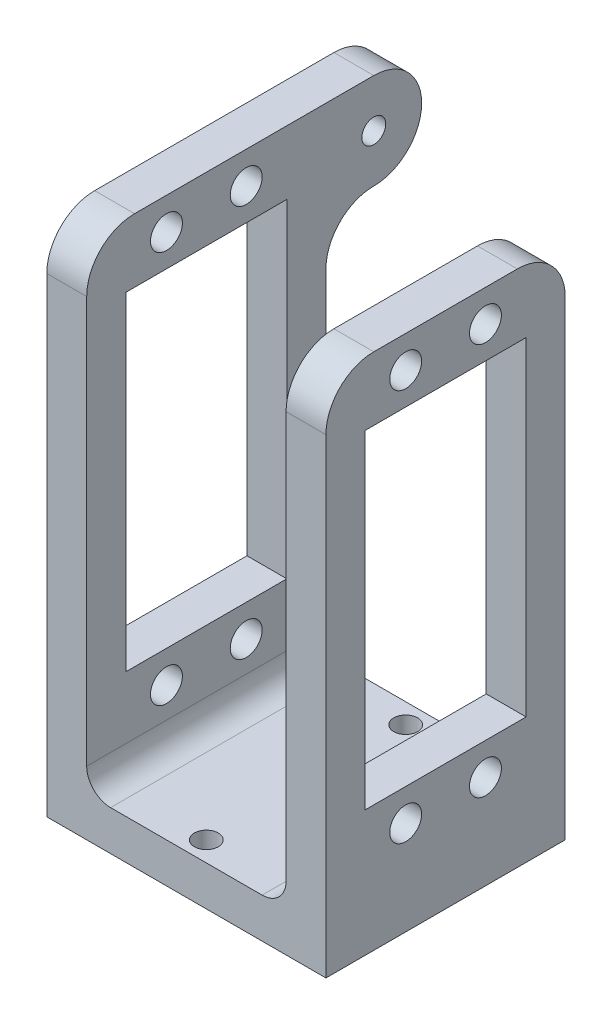
ISO-10303-21;
HEADER;
FILE_DESCRIPTION(('STEP AP214'),'2;1');
FILE_NAME('part.step','',(''),(''),'','','');
FILE_SCHEMA(('AUTOMOTIVE_DESIGN { 1 0 10303 214 1 1 1 1 }'));
ENDSEC;
DATA;
#1=APPLICATION_CONTEXT('core data for automotive mechanical design processes');
#2=APPLICATION_PROTOCOL_DEFINITION('international standard','automotive_design',2000,#1);
#3=PRODUCT_CONTEXT('',#1,'mechanical');
#4=PRODUCT('Part','Part','',(#3));
#5=PRODUCT_RELATED_PRODUCT_CATEGORY('part','',(#4));
#6=PRODUCT_DEFINITION_FORMATION('','',#4);
#7=PRODUCT_DEFINITION_CONTEXT('part definition',#1,'design');
#8=PRODUCT_DEFINITION('design','',#6,#7);
#9=PRODUCT_DEFINITION_SHAPE('','',#8);
#10=(LENGTH_UNIT() NAMED_UNIT(*) SI_UNIT(.MILLI.,.METRE.));
#11=(NAMED_UNIT(*) PLANE_ANGLE_UNIT() SI_UNIT($,.RADIAN.));
#12=(NAMED_UNIT(*) SI_UNIT($,.STERADIAN.) SOLID_ANGLE_UNIT());
#13=UNCERTAINTY_MEASURE_WITH_UNIT(LENGTH_MEASURE(1.E-05),#10,'distance_accuracy_value','');
#14=(GEOMETRIC_REPRESENTATION_CONTEXT(3) GLOBAL_UNCERTAINTY_ASSIGNED_CONTEXT((#13)) GLOBAL_UNIT_ASSIGNED_CONTEXT((#10,
#11,#12)) REPRESENTATION_CONTEXT('',''));
#15=CARTESIAN_POINT('',(0.,0.,0.));
#16=DIRECTION('',(0.,0.,1.));
#17=DIRECTION('',(1.,0.,0.));
#18=AXIS2_PLACEMENT_3D('',#15,#16,#17);
#19=CARTESIAN_POINT('',(0.,5.,-30.));
#20=DIRECTION('',(0.,0.,1.));
#21=DIRECTION('',(1.,0.,0.));
#22=AXIS2_PLACEMENT_3D('',#19,#20,#21);
#23=PLANE('',#22);
#24=DIRECTION('',(0.,-1.,0.));
#25=VECTOR('',#24,1.);
#26=CARTESIAN_POINT('',(30.,65.,-30.));
#27=LINE('',#26,#25);
#28=CARTESIAN_POINT('',(30.,59.,-30.));
#29=VERTEX_POINT('',#28);
#30=CARTESIAN_POINT('',(30.,8.,-30.));
#31=VERTEX_POINT('',#30);
#32=EDGE_CURVE('E315',#29,#31,#27,.T.);
#33=ORIENTED_EDGE('',*,*,#32,.F.);
#34=DIRECTION('',(-1.,0.,0.));
#35=VECTOR('',#34,1.);
#36=CARTESIAN_POINT('',(0.,59.,-30.));
#37=LINE('',#36,#35);
#38=CARTESIAN_POINT('',(35.,59.,-30.));
#39=VERTEX_POINT('',#38);
#40=EDGE_CURVE('E401',#29,#39,#37,.F.);
#41=ORIENTED_EDGE('',*,*,#40,.T.);
#42=DIRECTION('',(0.,-1.,0.));
#43=VECTOR('',#42,1.);
#44=CARTESIAN_POINT('',(35.,5.,-30.));
#45=LINE('',#44,#43);
#46=CARTESIAN_POINT('',(35.,0.,-30.));
#47=VERTEX_POINT('',#46);
#48=EDGE_CURVE('E344',#39,#47,#45,.T.);
#49=ORIENTED_EDGE('',*,*,#48,.T.);
#50=DIRECTION('',(-1.,0.,0.));
#51=VECTOR('',#50,1.);
#52=CARTESIAN_POINT('',(0.,0.,-30.));
#53=LINE('',#52,#51);
#54=CARTESIAN_POINT('',(0.,0.,-30.));
#55=VERTEX_POINT('',#54);
#56=EDGE_CURVE('E329',#47,#55,#53,.T.);
#57=ORIENTED_EDGE('',*,*,#56,.T.);
#58=DIRECTION('',(0.,-1.,0.));
#59=VECTOR('',#58,1.);
#60=CARTESIAN_POINT('',(0.,5.,-30.));
#61=LINE('',#60,#59);
#62=CARTESIAN_POINT('',(0.,47.,-30.));
#63=VERTEX_POINT('',#62);
#64=EDGE_CURVE('E332',#63,#55,#61,.T.);
#65=ORIENTED_EDGE('',*,*,#64,.F.);
#66=DIRECTION('',(-1.,0.,0.));
#67=VECTOR('',#66,1.);
#68=CARTESIAN_POINT('',(5.,47.,-30.));
#69=LINE('',#68,#67);
#70=CARTESIAN_POINT('',(5.,47.,-30.));
#71=VERTEX_POINT('',#70);
#72=EDGE_CURVE('E389',#63,#71,#69,.F.);
#73=ORIENTED_EDGE('',*,*,#72,.T.);
#74=DIRECTION('',(0.,-1.,0.));
#75=VECTOR('',#74,1.);
#76=CARTESIAN_POINT('',(5.,65.,-30.));
#77=LINE('',#76,#75);
#78=CARTESIAN_POINT('',(5.,8.,-30.));
#79=VERTEX_POINT('',#78);
#80=EDGE_CURVE('E196',#71,#79,#77,.T.);
#81=ORIENTED_EDGE('',*,*,#80,.T.);
#82=CARTESIAN_POINT('',(8.,8.,-30.));
#83=DIRECTION('',(0.,0.,1.));
#84=DIRECTION('',(1.,0.,0.));
#85=AXIS2_PLACEMENT_3D('',#82,#83,#84);
#86=CIRCLE('',#85,3.);
#87=CARTESIAN_POINT('',(8.,5.,-30.));
#88=VERTEX_POINT('',#87);
#89=EDGE_CURVE('E384',#79,#88,#86,.T.);
#90=ORIENTED_EDGE('',*,*,#89,.T.);
#91=DIRECTION('',(-1.,0.,0.));
#92=VECTOR('',#91,1.);
#93=CARTESIAN_POINT('',(0.,5.,-30.));
#94=LINE('',#93,#92);
#95=CARTESIAN_POINT('',(27.,5.,-30.));
#96=VERTEX_POINT('',#95);
#97=EDGE_CURVE('E328',#96,#88,#94,.T.);
#98=ORIENTED_EDGE('',*,*,#97,.F.);
#99=CARTESIAN_POINT('',(27.,8.,-30.));
#100=DIRECTION('',(0.,0.,1.));
#101=DIRECTION('',(1.,0.,0.));
#102=AXIS2_PLACEMENT_3D('',#99,#100,#101);
#103=CIRCLE('',#102,3.);
#104=EDGE_CURVE('E381',#96,#31,#103,.T.);
#105=ORIENTED_EDGE('',*,*,#104,.T.);
#106=EDGE_LOOP('',(#33,#41,#49,#57,#65,#73,#81,#90,#98,#105));
#107=FACE_BOUND('',#106,.T.);
#108=ADVANCED_FACE('F34',(#107),#23,.F.);
#109=CARTESIAN_POINT('',(0.,5.,0.));
#110=DIRECTION('',(0.,-1.,0.));
#111=DIRECTION('',(0.,0.,-1.));
#112=AXIS2_PLACEMENT_3D('',#109,#110,#111);
#113=PLANE('',#112);
#114=CARTESIAN_POINT('',(17.5,5.,-27.5));
#115=DIRECTION('',(0.,1.,0.));
#116=DIRECTION('',(0.,0.,1.));
#117=AXIS2_PLACEMENT_3D('',#114,#115,#116);
#118=CIRCLE('',#117,1.5);
#119=CARTESIAN_POINT('',(17.5,5.,-26.));
#120=VERTEX_POINT('',#119);
#121=EDGE_CURVE('E438',#120,#120,#118,.T.);
#122=ORIENTED_EDGE('',*,*,#121,.F.);
#123=EDGE_LOOP('',(#122));
#124=FACE_BOUND('',#123,.T.);
#125=CARTESIAN_POINT('',(17.5,5.,-2.5));
#126=DIRECTION('',(0.,1.,0.));
#127=DIRECTION('',(0.,0.,1.));
#128=AXIS2_PLACEMENT_3D('',#125,#126,#127);
#129=CIRCLE('',#128,1.5);
#130=CARTESIAN_POINT('',(17.5,5.,-0.999999999999999));
#131=VERTEX_POINT('',#130);
#132=EDGE_CURVE('E432',#131,#131,#129,.T.);
#133=ORIENTED_EDGE('',*,*,#132,.F.);
#134=EDGE_LOOP('',(#133));
#135=FACE_BOUND('',#134,.T.);
#136=DIRECTION('',(1.,0.,0.));
#137=VECTOR('',#136,1.);
#138=CARTESIAN_POINT('',(0.,5.,0.));
#139=LINE('',#138,#137);
#140=CARTESIAN_POINT('',(8.,5.,0.));
#141=VERTEX_POINT('',#140);
#142=CARTESIAN_POINT('',(27.,5.,0.));
#143=VERTEX_POINT('',#142);
#144=EDGE_CURVE('E325',#141,#143,#139,.T.);
#145=ORIENTED_EDGE('',*,*,#144,.T.);
#146=DIRECTION('',(0.,0.,1.));
#147=VECTOR('',#146,1.);
#148=CARTESIAN_POINT('',(27.,5.,-30.));
#149=LINE('',#148,#147);
#150=EDGE_CURVE('E375',#143,#96,#149,.F.);
#151=ORIENTED_EDGE('',*,*,#150,.T.);
#152=ORIENTED_EDGE('',*,*,#97,.T.);
#153=DIRECTION('',(0.,0.,-1.));
#154=VECTOR('',#153,1.);
#155=CARTESIAN_POINT('',(8.,5.,0.));
#156=LINE('',#155,#154);
#157=EDGE_CURVE('E373',#88,#141,#156,.F.);
#158=ORIENTED_EDGE('',*,*,#157,.T.);
#159=EDGE_LOOP('',(#145,#151,#152,#158));
#160=FACE_BOUND('',#159,.T.);
#161=ADVANCED_FACE('F455',(#124,#135,#160),#113,.F.);
#162=CARTESIAN_POINT('',(0.,5.,0.));
#163=DIRECTION('',(1.,0.,0.));
#164=DIRECTION('',(0.,0.,-1.));
#165=AXIS2_PLACEMENT_3D('',#162,#163,#164);
#166=PLANE('',#165);
#167=CARTESIAN_POINT('',(0.,11.8,-20.));
#168=DIRECTION('',(1.,0.,0.));
#169=DIRECTION('',(0.,0.,-1.));
#170=AXIS2_PLACEMENT_3D('',#167,#168,#169);
#171=CIRCLE('',#170,2.);
#172=CARTESIAN_POINT('',(0.,11.8,-22.));
#173=VERTEX_POINT('',#172);
#174=EDGE_CURVE('E304',#173,#173,#171,.T.);
#175=ORIENTED_EDGE('',*,*,#174,.T.);
#176=EDGE_LOOP('',(#175));
#177=FACE_BOUND('',#176,.T.);
#178=CARTESIAN_POINT('',(0.,11.8,-10.));
#179=DIRECTION('',(1.,0.,0.));
#180=DIRECTION('',(0.,0.,-1.));
#181=AXIS2_PLACEMENT_3D('',#178,#179,#180);
#182=CIRCLE('',#181,2.);
#183=CARTESIAN_POINT('',(0.,11.8,-12.));
#184=VERTEX_POINT('',#183);
#185=EDGE_CURVE('E297',#184,#184,#182,.T.);
#186=ORIENTED_EDGE('',*,*,#185,.T.);
#187=EDGE_LOOP('',(#186));
#188=FACE_BOUND('',#187,.T.);
#189=CARTESIAN_POINT('',(0.,61.,-20.));
#190=DIRECTION('',(1.,0.,0.));
#191=DIRECTION('',(0.,0.,-1.));
#192=AXIS2_PLACEMENT_3D('',#189,#190,#191);
#193=CIRCLE('',#192,2.);
#194=CARTESIAN_POINT('',(0.,61.,-22.));
#195=VERTEX_POINT('',#194);
#196=EDGE_CURVE('E290',#195,#195,#193,.T.);
#197=ORIENTED_EDGE('',*,*,#196,.T.);
#198=EDGE_LOOP('',(#197));
#199=FACE_BOUND('',#198,.T.);
#200=CARTESIAN_POINT('',(0.,61.,-10.));
#201=DIRECTION('',(1.,0.,0.));
#202=DIRECTION('',(0.,0.,-1.));
#203=AXIS2_PLACEMENT_3D('',#200,#201,#202);
#204=CIRCLE('',#203,2.);
#205=CARTESIAN_POINT('',(0.,61.,-12.));
#206=VERTEX_POINT('',#205);
#207=EDGE_CURVE('E283',#206,#206,#204,.T.);
#208=ORIENTED_EDGE('',*,*,#207,.T.);
#209=EDGE_LOOP('',(#208));
#210=FACE_BOUND('',#209,.T.);
#211=DIRECTION('',(0.,0.,1.));
#212=VECTOR('',#211,1.);
#213=CARTESIAN_POINT('',(0.,57.,0.));
#214=LINE('',#213,#212);
#215=CARTESIAN_POINT('',(0.,57.,-25.1));
#216=VERTEX_POINT('',#215);
#217=CARTESIAN_POINT('',(0.,57.,-4.9));
#218=VERTEX_POINT('',#217);
#219=EDGE_CURVE('E270',#216,#218,#214,.T.);
#220=ORIENTED_EDGE('',*,*,#219,.T.);
#221=DIRECTION('',(0.,-1.,0.));
#222=VECTOR('',#221,1.);
#223=CARTESIAN_POINT('',(0.,5.,-4.9));
#224=LINE('',#223,#222);
#225=CARTESIAN_POINT('',(0.,15.8,-4.9));
#226=VERTEX_POINT('',#225);
#227=EDGE_CURVE('E276',#218,#226,#224,.T.);
#228=ORIENTED_EDGE('',*,*,#227,.T.);
#229=DIRECTION('',(0.,0.,-1.));
#230=VECTOR('',#229,1.);
#231=CARTESIAN_POINT('',(0.,15.8,0.));
#232=LINE('',#231,#230);
#233=CARTESIAN_POINT('',(0.,15.8,-25.1));
#234=VERTEX_POINT('',#233);
#235=EDGE_CURVE('E258',#226,#234,#232,.T.);
#236=ORIENTED_EDGE('',*,*,#235,.T.);
#237=DIRECTION('',(0.,1.,0.));
#238=VECTOR('',#237,1.);
#239=CARTESIAN_POINT('',(0.,5.,-25.1));
#240=LINE('',#239,#238);
#241=EDGE_CURVE('E264',#234,#216,#240,.T.);
#242=ORIENTED_EDGE('',*,*,#241,.T.);
#243=EDGE_LOOP('',(#220,#228,#236,#242));
#244=FACE_BOUND('',#243,.T.);
#245=DIRECTION('',(0.,-1.,0.));
#246=VECTOR('',#245,1.);
#247=CARTESIAN_POINT('',(0.,5.,0.));
#248=LINE('',#247,#246);
#249=CARTESIAN_POINT('',(0.,59.,0.));
#250=VERTEX_POINT('',#249);
#251=CARTESIAN_POINT('',(0.,0.,0.));
#252=VERTEX_POINT('',#251);
#253=EDGE_CURVE('E348',#250,#252,#248,.T.);
#254=ORIENTED_EDGE('',*,*,#253,.F.);
#255=CARTESIAN_POINT('',(0.,59.,-6.));
#256=DIRECTION('',(1.,0.,0.));
#257=DIRECTION('',(0.,0.,-1.));
#258=AXIS2_PLACEMENT_3D('',#255,#256,#257);
#259=CIRCLE('',#258,6.);
#260=CARTESIAN_POINT('',(0.,65.,-6.));
#261=VERTEX_POINT('',#260);
#262=EDGE_CURVE('E11',#250,#261,#259,.F.);
#263=ORIENTED_EDGE('',*,*,#262,.T.);
#264=DIRECTION('',(0.,0.,1.));
#265=VECTOR('',#264,1.);
#266=CARTESIAN_POINT('',(0.,65.,-30.));
#267=LINE('',#266,#265);
#268=CARTESIAN_POINT('',(0.,65.,-36.));
#269=VERTEX_POINT('',#268);
#270=EDGE_CURVE('E317',#269,#261,#267,.T.);
#271=ORIENTED_EDGE('',*,*,#270,.F.);
#272=CARTESIAN_POINT('',(0.,59.,-36.));
#273=DIRECTION('',(-1.,0.,0.));
#274=DIRECTION('',(0.,0.,1.));
#275=AXIS2_PLACEMENT_3D('',#272,#273,#274);
#276=CIRCLE('',#275,6.00000000000001);
#277=CARTESIAN_POINT('',(0.,53.,-36.));
#278=VERTEX_POINT('',#277);
#279=EDGE_CURVE('E423',#269,#278,#276,.T.);
#280=ORIENTED_EDGE('',*,*,#279,.T.);
#281=CARTESIAN_POINT('',(0.,47.,-36.));
#282=DIRECTION('',(1.,0.,0.));
#283=DIRECTION('',(0.,0.,-1.));
#284=AXIS2_PLACEMENT_3D('',#281,#282,#283);
#285=CIRCLE('',#284,6.);
#286=EDGE_CURVE('E201',#278,#63,#285,.T.);
#287=ORIENTED_EDGE('',*,*,#286,.T.);
#288=ORIENTED_EDGE('',*,*,#64,.T.);
#289=DIRECTION('',(0.,0.,1.));
#290=VECTOR('',#289,1.);
#291=CARTESIAN_POINT('',(0.,0.,0.));
#292=LINE('',#291,#290);
#293=EDGE_CURVE('E324',#55,#252,#292,.T.);
#294=ORIENTED_EDGE('',*,*,#293,.T.);
#295=EDGE_LOOP('',(#254,#263,#271,#280,#287,#288,#294));
#296=FACE_BOUND('',#295,.T.);
#297=CARTESIAN_POINT('',(0.,59.,-36.));
#298=DIRECTION('',(-1.,0.,0.));
#299=DIRECTION('',(0.,0.,1.));
#300=AXIS2_PLACEMENT_3D('',#297,#298,#299);
#301=CIRCLE('',#300,1.5);
#302=CARTESIAN_POINT('',(0.,59.,-34.5));
#303=VERTEX_POINT('',#302);
#304=EDGE_CURVE('E425',#303,#303,#301,.T.);
#305=ORIENTED_EDGE('',*,*,#304,.F.);
#306=EDGE_LOOP('',(#305));
#307=FACE_BOUND('',#306,.T.);
#308=ADVANCED_FACE('F421',(#177,#188,#199,#210,#244,#296,#307),#166,.F.);
#309=CARTESIAN_POINT('',(0.,5.,0.));
#310=DIRECTION('',(0.,0.,-1.));
#311=DIRECTION('',(-1.,0.,0.));
#312=AXIS2_PLACEMENT_3D('',#309,#310,#311);
#313=PLANE('',#312);
#314=DIRECTION('',(0.,-1.,0.));
#315=VECTOR('',#314,1.);
#316=CARTESIAN_POINT('',(35.,5.,0.));
#317=LINE('',#316,#315);
#318=CARTESIAN_POINT('',(35.,59.,0.));
#319=VERTEX_POINT('',#318);
#320=CARTESIAN_POINT('',(35.,0.,0.));
#321=VERTEX_POINT('',#320);
#322=EDGE_CURVE('E346',#319,#321,#317,.T.);
#323=ORIENTED_EDGE('',*,*,#322,.F.);
#324=DIRECTION('',(1.,0.,0.));
#325=VECTOR('',#324,1.);
#326=CARTESIAN_POINT('',(0.,59.,0.));
#327=LINE('',#326,#325);
#328=CARTESIAN_POINT('',(30.,59.,0.));
#329=VERTEX_POINT('',#328);
#330=EDGE_CURVE('E409',#319,#329,#327,.F.);
#331=ORIENTED_EDGE('',*,*,#330,.T.);
#332=DIRECTION('',(0.,-1.,0.));
#333=VECTOR('',#332,1.);
#334=CARTESIAN_POINT('',(30.,65.,0.));
#335=LINE('',#334,#333);
#336=CARTESIAN_POINT('',(30.,8.,0.));
#337=VERTEX_POINT('',#336);
#338=EDGE_CURVE('E313',#329,#337,#335,.T.);
#339=ORIENTED_EDGE('',*,*,#338,.T.);
#340=CARTESIAN_POINT('',(27.,8.,0.));
#341=DIRECTION('',(0.,0.,-1.));
#342=DIRECTION('',(-1.,0.,0.));
#343=AXIS2_PLACEMENT_3D('',#340,#341,#342);
#344=CIRCLE('',#343,3.);
#345=EDGE_CURVE('E379',#337,#143,#344,.T.);
#346=ORIENTED_EDGE('',*,*,#345,.T.);
#347=ORIENTED_EDGE('',*,*,#144,.F.);
#348=CARTESIAN_POINT('',(8.,8.,0.));
#349=DIRECTION('',(0.,0.,-1.));
#350=DIRECTION('',(-1.,0.,0.));
#351=AXIS2_PLACEMENT_3D('',#348,#349,#350);
#352=CIRCLE('',#351,3.);
#353=CARTESIAN_POINT('',(5.,8.,0.));
#354=VERTEX_POINT('',#353);
#355=EDGE_CURVE('E386',#141,#354,#352,.T.);
#356=ORIENTED_EDGE('',*,*,#355,.T.);
#357=DIRECTION('',(0.,-1.,0.));
#358=VECTOR('',#357,1.);
#359=CARTESIAN_POINT('',(5.,65.,0.));
#360=LINE('',#359,#358);
#361=CARTESIAN_POINT('',(5.,59.,0.));
#362=VERTEX_POINT('',#361);
#363=EDGE_CURVE('E322',#362,#354,#360,.T.);
#364=ORIENTED_EDGE('',*,*,#363,.F.);
#365=DIRECTION('',(1.,0.,0.));
#366=VECTOR('',#365,1.);
#367=CARTESIAN_POINT('',(0.,59.,0.));
#368=LINE('',#367,#366);
#369=EDGE_CURVE('E407',#362,#250,#368,.F.);
#370=ORIENTED_EDGE('',*,*,#369,.T.);
#371=ORIENTED_EDGE('',*,*,#253,.T.);
#372=DIRECTION('',(1.,0.,0.));
#373=VECTOR('',#372,1.);
#374=CARTESIAN_POINT('',(0.,0.,0.));
#375=LINE('',#374,#373);
#376=EDGE_CURVE('E335',#252,#321,#375,.T.);
#377=ORIENTED_EDGE('',*,*,#376,.T.);
#378=EDGE_LOOP('',(#323,#331,#339,#346,#347,#356,#364,#370,#371,#377));
#379=FACE_BOUND('',#378,.T.);
#380=ADVANCED_FACE('F415',(#379),#313,.F.);
#381=CARTESIAN_POINT('',(35.,5.,0.));
#382=DIRECTION('',(-1.,0.,0.));
#383=DIRECTION('',(0.,0.,1.));
#384=AXIS2_PLACEMENT_3D('',#381,#382,#383);
#385=PLANE('',#384);
#386=CARTESIAN_POINT('',(35.,11.8,-20.));
#387=DIRECTION('',(1.,0.,0.));
#388=DIRECTION('',(0.,0.,-1.));
#389=AXIS2_PLACEMENT_3D('',#386,#387,#388);
#390=CIRCLE('',#389,2.);
#391=CARTESIAN_POINT('',(35.,11.8,-22.));
#392=VERTEX_POINT('',#391);
#393=EDGE_CURVE('E216',#392,#392,#390,.T.);
#394=ORIENTED_EDGE('',*,*,#393,.F.);
#395=EDGE_LOOP('',(#394));
#396=FACE_BOUND('',#395,.T.);
#397=CARTESIAN_POINT('',(35.,11.8,-10.));
#398=DIRECTION('',(1.,0.,0.));
#399=DIRECTION('',(0.,0.,-1.));
#400=AXIS2_PLACEMENT_3D('',#397,#398,#399);
#401=CIRCLE('',#400,2.);
#402=CARTESIAN_POINT('',(35.,11.8,-12.));
#403=VERTEX_POINT('',#402);
#404=EDGE_CURVE('E227',#403,#403,#401,.T.);
#405=ORIENTED_EDGE('',*,*,#404,.F.);
#406=EDGE_LOOP('',(#405));
#407=FACE_BOUND('',#406,.T.);
#408=CARTESIAN_POINT('',(35.,61.,-20.));
#409=DIRECTION('',(1.,0.,0.));
#410=DIRECTION('',(0.,0.,-1.));
#411=AXIS2_PLACEMENT_3D('',#408,#409,#410);
#412=CIRCLE('',#411,2.);
#413=CARTESIAN_POINT('',(35.,61.,-22.));
#414=VERTEX_POINT('',#413);
#415=EDGE_CURVE('E224',#414,#414,#412,.T.);
#416=ORIENTED_EDGE('',*,*,#415,.F.);
#417=EDGE_LOOP('',(#416));
#418=FACE_BOUND('',#417,.T.);
#419=CARTESIAN_POINT('',(35.,61.,-10.));
#420=DIRECTION('',(1.,0.,0.));
#421=DIRECTION('',(0.,0.,-1.));
#422=AXIS2_PLACEMENT_3D('',#419,#420,#421);
#423=CIRCLE('',#422,2.);
#424=CARTESIAN_POINT('',(35.,61.,-12.));
#425=VERTEX_POINT('',#424);
#426=EDGE_CURVE('E220',#425,#425,#423,.T.);
#427=ORIENTED_EDGE('',*,*,#426,.F.);
#428=EDGE_LOOP('',(#427));
#429=FACE_BOUND('',#428,.T.);
#430=DIRECTION('',(0.,0.,-1.));
#431=VECTOR('',#430,1.);
#432=CARTESIAN_POINT('',(35.,15.8,-4.9));
#433=LINE('',#432,#431);
#434=CARTESIAN_POINT('',(35.,15.8,-4.9));
#435=VERTEX_POINT('',#434);
#436=CARTESIAN_POINT('',(35.,15.8,-25.1));
#437=VERTEX_POINT('',#436);
#438=EDGE_CURVE('E233',#435,#437,#433,.T.);
#439=ORIENTED_EDGE('',*,*,#438,.F.);
#440=DIRECTION('',(0.,-1.,0.));
#441=VECTOR('',#440,1.);
#442=CARTESIAN_POINT('',(35.,57.,-4.9));
#443=LINE('',#442,#441);
#444=CARTESIAN_POINT('',(35.,57.,-4.9));
#445=VERTEX_POINT('',#444);
#446=EDGE_CURVE('E223',#445,#435,#443,.T.);
#447=ORIENTED_EDGE('',*,*,#446,.F.);
#448=DIRECTION('',(0.,0.,1.));
#449=VECTOR('',#448,1.);
#450=CARTESIAN_POINT('',(35.,57.,-4.9));
#451=LINE('',#450,#449);
#452=CARTESIAN_POINT('',(35.,57.,-25.1));
#453=VERTEX_POINT('',#452);
#454=EDGE_CURVE('E239',#453,#445,#451,.T.);
#455=ORIENTED_EDGE('',*,*,#454,.F.);
#456=DIRECTION('',(0.,1.,0.));
#457=VECTOR('',#456,1.);
#458=CARTESIAN_POINT('',(35.,57.,-25.1));
#459=LINE('',#458,#457);
#460=EDGE_CURVE('E236',#437,#453,#459,.T.);
#461=ORIENTED_EDGE('',*,*,#460,.F.);
#462=EDGE_LOOP('',(#439,#447,#455,#461));
#463=FACE_BOUND('',#462,.T.);
#464=ORIENTED_EDGE('',*,*,#48,.F.);
#465=CARTESIAN_POINT('',(35.,59.,-24.));
#466=DIRECTION('',(-1.,0.,0.));
#467=DIRECTION('',(0.,0.,1.));
#468=AXIS2_PLACEMENT_3D('',#465,#466,#467);
#469=CIRCLE('',#468,6.);
#470=CARTESIAN_POINT('',(35.,65.,-24.));
#471=VERTEX_POINT('',#470);
#472=EDGE_CURVE('E405',#39,#471,#469,.F.);
#473=ORIENTED_EDGE('',*,*,#472,.T.);
#474=DIRECTION('',(0.,0.,-1.));
#475=VECTOR('',#474,1.);
#476=CARTESIAN_POINT('',(35.,65.,-30.));
#477=LINE('',#476,#475);
#478=CARTESIAN_POINT('',(35.,65.,-6.));
#479=VERTEX_POINT('',#478);
#480=EDGE_CURVE('E307',#479,#471,#477,.T.);
#481=ORIENTED_EDGE('',*,*,#480,.F.);
#482=CARTESIAN_POINT('',(35.,59.,-6.));
#483=DIRECTION('',(-1.,0.,0.));
#484=DIRECTION('',(0.,0.,1.));
#485=AXIS2_PLACEMENT_3D('',#482,#483,#484);
#486=CIRCLE('',#485,6.);
#487=EDGE_CURVE('E403',#479,#319,#486,.F.);
#488=ORIENTED_EDGE('',*,*,#487,.T.);
#489=ORIENTED_EDGE('',*,*,#322,.T.);
#490=DIRECTION('',(0.,0.,-1.));
#491=VECTOR('',#490,1.);
#492=CARTESIAN_POINT('',(35.,0.,0.));
#493=LINE('',#492,#491);
#494=EDGE_CURVE('E338',#321,#47,#493,.T.);
#495=ORIENTED_EDGE('',*,*,#494,.T.);
#496=EDGE_LOOP('',(#464,#473,#481,#488,#489,#495));
#497=FACE_BOUND('',#496,.T.);
#498=ADVANCED_FACE('F494',(#396,#407,#418,#429,#463,#497),#385,.F.);
#499=CARTESIAN_POINT('',(0.,0.,0.));
#500=DIRECTION('',(0.,-1.,0.));
#501=DIRECTION('',(0.,0.,-1.));
#502=AXIS2_PLACEMENT_3D('',#499,#500,#501);
#503=PLANE('',#502);
#504=CARTESIAN_POINT('',(17.5,0.,-27.5));
#505=DIRECTION('',(0.,1.,0.));
#506=DIRECTION('',(0.,0.,1.));
#507=AXIS2_PLACEMENT_3D('',#504,#505,#506);
#508=CIRCLE('',#507,1.5);
#509=CARTESIAN_POINT('',(17.5,0.,-26.));
#510=VERTEX_POINT('',#509);
#511=EDGE_CURVE('E429',#510,#510,#508,.T.);
#512=ORIENTED_EDGE('',*,*,#511,.T.);
#513=EDGE_LOOP('',(#512));
#514=FACE_BOUND('',#513,.T.);
#515=CARTESIAN_POINT('',(17.5,0.,-2.5));
#516=DIRECTION('',(0.,1.,0.));
#517=DIRECTION('',(0.,0.,1.));
#518=AXIS2_PLACEMENT_3D('',#515,#516,#517);
#519=CIRCLE('',#518,1.5);
#520=CARTESIAN_POINT('',(17.5,0.,-0.999999999999999));
#521=VERTEX_POINT('',#520);
#522=EDGE_CURVE('E435',#521,#521,#519,.T.);
#523=ORIENTED_EDGE('',*,*,#522,.T.);
#524=EDGE_LOOP('',(#523));
#525=FACE_BOUND('',#524,.T.);
#526=ORIENTED_EDGE('',*,*,#293,.F.);
#527=ORIENTED_EDGE('',*,*,#56,.F.);
#528=ORIENTED_EDGE('',*,*,#494,.F.);
#529=ORIENTED_EDGE('',*,*,#376,.F.);
#530=EDGE_LOOP('',(#526,#527,#528,#529));
#531=FACE_BOUND('',#530,.T.);
#532=ADVANCED_FACE('F444',(#514,#525,#531),#503,.T.);
#533=CARTESIAN_POINT('',(5.,65.,-30.));
#534=DIRECTION('',(-1.,0.,0.));
#535=DIRECTION('',(0.,0.,1.));
#536=AXIS2_PLACEMENT_3D('',#533,#534,#535);
#537=PLANE('',#536);
#538=CARTESIAN_POINT('',(5.,11.8,-20.));
#539=DIRECTION('',(-1.,0.,0.));
#540=DIRECTION('',(0.,0.,1.));
#541=AXIS2_PLACEMENT_3D('',#538,#539,#540);
#542=CIRCLE('',#541,2.);
#543=CARTESIAN_POINT('',(5.,11.8,-18.));
#544=VERTEX_POINT('',#543);
#545=EDGE_CURVE('E301',#544,#544,#542,.T.);
#546=ORIENTED_EDGE('',*,*,#545,.T.);
#547=EDGE_LOOP('',(#546));
#548=FACE_BOUND('',#547,.T.);
#549=CARTESIAN_POINT('',(5.,11.8,-10.));
#550=DIRECTION('',(-1.,0.,0.));
#551=DIRECTION('',(0.,0.,1.));
#552=AXIS2_PLACEMENT_3D('',#549,#550,#551);
#553=CIRCLE('',#552,2.);
#554=CARTESIAN_POINT('',(5.,11.8,-8.));
#555=VERTEX_POINT('',#554);
#556=EDGE_CURVE('E294',#555,#555,#553,.T.);
#557=ORIENTED_EDGE('',*,*,#556,.T.);
#558=EDGE_LOOP('',(#557));
#559=FACE_BOUND('',#558,.T.);
#560=CARTESIAN_POINT('',(5.,61.,-20.));
#561=DIRECTION('',(-1.,0.,0.));
#562=DIRECTION('',(0.,0.,1.));
#563=AXIS2_PLACEMENT_3D('',#560,#561,#562);
#564=CIRCLE('',#563,2.);
#565=CARTESIAN_POINT('',(5.,61.,-18.));
#566=VERTEX_POINT('',#565);
#567=EDGE_CURVE('E287',#566,#566,#564,.T.);
#568=ORIENTED_EDGE('',*,*,#567,.T.);
#569=EDGE_LOOP('',(#568));
#570=FACE_BOUND('',#569,.T.);
#571=CARTESIAN_POINT('',(5.,61.,-10.));
#572=DIRECTION('',(-1.,0.,0.));
#573=DIRECTION('',(0.,0.,1.));
#574=AXIS2_PLACEMENT_3D('',#571,#572,#573);
#575=CIRCLE('',#574,2.);
#576=CARTESIAN_POINT('',(5.,61.,-8.));
#577=VERTEX_POINT('',#576);
#578=EDGE_CURVE('E280',#577,#577,#575,.T.);
#579=ORIENTED_EDGE('',*,*,#578,.T.);
#580=EDGE_LOOP('',(#579));
#581=FACE_BOUND('',#580,.T.);
#582=DIRECTION('',(0.,0.,1.));
#583=VECTOR('',#582,1.);
#584=CARTESIAN_POINT('',(5.,15.8,-30.));
#585=LINE('',#584,#583);
#586=CARTESIAN_POINT('',(5.,15.8,-25.1));
#587=VERTEX_POINT('',#586);
#588=CARTESIAN_POINT('',(5.,15.8,-4.9));
#589=VERTEX_POINT('',#588);
#590=EDGE_CURVE('E255',#587,#589,#585,.T.);
#591=ORIENTED_EDGE('',*,*,#590,.T.);
#592=DIRECTION('',(0.,1.,0.));
#593=VECTOR('',#592,1.);
#594=CARTESIAN_POINT('',(5.,65.,-4.9));
#595=LINE('',#594,#593);
#596=CARTESIAN_POINT('',(5.,57.,-4.9));
#597=VERTEX_POINT('',#596);
#598=EDGE_CURVE('E273',#589,#597,#595,.T.);
#599=ORIENTED_EDGE('',*,*,#598,.T.);
#600=DIRECTION('',(0.,0.,-1.));
#601=VECTOR('',#600,1.);
#602=CARTESIAN_POINT('',(5.,57.,-30.));
#603=LINE('',#602,#601);
#604=CARTESIAN_POINT('',(5.,57.,-25.1));
#605=VERTEX_POINT('',#604);
#606=EDGE_CURVE('E267',#597,#605,#603,.T.);
#607=ORIENTED_EDGE('',*,*,#606,.T.);
#608=DIRECTION('',(0.,-1.,0.));
#609=VECTOR('',#608,1.);
#610=CARTESIAN_POINT('',(5.,65.,-25.1));
#611=LINE('',#610,#609);
#612=EDGE_CURVE('E261',#605,#587,#611,.T.);
#613=ORIENTED_EDGE('',*,*,#612,.T.);
#614=EDGE_LOOP('',(#591,#599,#607,#613));
#615=FACE_BOUND('',#614,.T.);
#616=DIRECTION('',(0.,0.,-1.));
#617=VECTOR('',#616,1.);
#618=CARTESIAN_POINT('',(5.,65.,-30.));
#619=LINE('',#618,#617);
#620=CARTESIAN_POINT('',(5.,65.,-6.));
#621=VERTEX_POINT('',#620);
#622=CARTESIAN_POINT('',(5.,65.,-36.));
#623=VERTEX_POINT('',#622);
#624=EDGE_CURVE('E319',#621,#623,#619,.T.);
#625=ORIENTED_EDGE('',*,*,#624,.F.);
#626=CARTESIAN_POINT('',(5.,59.,-6.));
#627=DIRECTION('',(-1.,0.,0.));
#628=DIRECTION('',(0.,0.,1.));
#629=AXIS2_PLACEMENT_3D('',#626,#627,#628);
#630=CIRCLE('',#629,6.);
#631=EDGE_CURVE('E42',#621,#362,#630,.F.);
#632=ORIENTED_EDGE('',*,*,#631,.T.);
#633=ORIENTED_EDGE('',*,*,#363,.T.);
#634=DIRECTION('',(0.,0.,-1.));
#635=VECTOR('',#634,1.);
#636=CARTESIAN_POINT('',(5.,8.,-30.));
#637=LINE('',#636,#635);
#638=EDGE_CURVE('E377',#354,#79,#637,.T.);
#639=ORIENTED_EDGE('',*,*,#638,.T.);
#640=ORIENTED_EDGE('',*,*,#80,.F.);
#641=CARTESIAN_POINT('',(5.,47.,-36.));
#642=DIRECTION('',(-1.,0.,0.));
#643=DIRECTION('',(0.,0.,1.));
#644=AXIS2_PLACEMENT_3D('',#641,#642,#643);
#645=CIRCLE('',#644,6.);
#646=CARTESIAN_POINT('',(5.,53.,-36.));
#647=VERTEX_POINT('',#646);
#648=EDGE_CURVE('E189',#71,#647,#645,.T.);
#649=ORIENTED_EDGE('',*,*,#648,.T.);
#650=CARTESIAN_POINT('',(5.,59.,-36.));
#651=DIRECTION('',(-1.,0.,0.));
#652=DIRECTION('',(0.,0.,1.));
#653=AXIS2_PLACEMENT_3D('',#650,#651,#652);
#654=CIRCLE('',#653,6.00000000000001);
#655=EDGE_CURVE('E194',#623,#647,#654,.T.);
#656=ORIENTED_EDGE('',*,*,#655,.F.);
#657=EDGE_LOOP('',(#625,#632,#633,#639,#640,#649,#656));
#658=FACE_BOUND('',#657,.T.);
#659=CARTESIAN_POINT('',(5.,59.,-36.));
#660=DIRECTION('',(-1.,0.,0.));
#661=DIRECTION('',(0.,0.,1.));
#662=AXIS2_PLACEMENT_3D('',#659,#660,#661);
#663=CIRCLE('',#662,1.5);
#664=CARTESIAN_POINT('',(5.,59.,-34.5));
#665=VERTEX_POINT('',#664);
#666=EDGE_CURVE('E212',#665,#665,#663,.T.);
#667=ORIENTED_EDGE('',*,*,#666,.T.);
#668=EDGE_LOOP('',(#667));
#669=FACE_BOUND('',#668,.T.);
#670=ADVANCED_FACE('F192',(#548,#559,#570,#581,#615,#658,#669),#537,.F.);
#671=CARTESIAN_POINT('',(0.,65.,0.));
#672=DIRECTION('',(0.,1.,0.));
#673=DIRECTION('',(0.,0.,1.));
#674=AXIS2_PLACEMENT_3D('',#671,#672,#673);
#675=PLANE('',#674);
#676=ORIENTED_EDGE('',*,*,#270,.T.);
#677=DIRECTION('',(1.,0.,0.));
#678=VECTOR('',#677,1.);
#679=CARTESIAN_POINT('',(5.,65.,-6.));
#680=LINE('',#679,#678);
#681=EDGE_CURVE('E411',#261,#621,#680,.T.);
#682=ORIENTED_EDGE('',*,*,#681,.T.);
#683=ORIENTED_EDGE('',*,*,#624,.T.);
#684=DIRECTION('',(-1.,0.,0.));
#685=VECTOR('',#684,1.);
#686=CARTESIAN_POINT('',(5.,65.,-36.));
#687=LINE('',#686,#685);
#688=EDGE_CURVE('E211',#623,#269,#687,.T.);
#689=ORIENTED_EDGE('',*,*,#688,.T.);
#690=EDGE_LOOP('',(#676,#682,#683,#689));
#691=FACE_BOUND('',#690,.T.);
#692=ADVANCED_FACE('F420',(#691),#675,.T.);
#693=CARTESIAN_POINT('',(30.,65.,-30.));
#694=DIRECTION('',(1.,0.,0.));
#695=DIRECTION('',(0.,0.,-1.));
#696=AXIS2_PLACEMENT_3D('',#693,#694,#695);
#697=PLANE('',#696);
#698=CARTESIAN_POINT('',(30.,11.8,-20.));
#699=DIRECTION('',(1.,0.,0.));
#700=DIRECTION('',(0.,0.,-1.));
#701=AXIS2_PLACEMENT_3D('',#698,#699,#700);
#702=CIRCLE('',#701,2.);
#703=CARTESIAN_POINT('',(30.,11.8,-22.));
#704=VERTEX_POINT('',#703);
#705=EDGE_CURVE('E300',#704,#704,#702,.T.);
#706=ORIENTED_EDGE('',*,*,#705,.T.);
#707=EDGE_LOOP('',(#706));
#708=FACE_BOUND('',#707,.T.);
#709=CARTESIAN_POINT('',(30.,11.8,-10.));
#710=DIRECTION('',(1.,0.,0.));
#711=DIRECTION('',(0.,0.,-1.));
#712=AXIS2_PLACEMENT_3D('',#709,#710,#711);
#713=CIRCLE('',#712,2.);
#714=CARTESIAN_POINT('',(30.,11.8,-12.));
#715=VERTEX_POINT('',#714);
#716=EDGE_CURVE('E293',#715,#715,#713,.T.);
#717=ORIENTED_EDGE('',*,*,#716,.T.);
#718=EDGE_LOOP('',(#717));
#719=FACE_BOUND('',#718,.T.);
#720=CARTESIAN_POINT('',(30.,61.,-20.));
#721=DIRECTION('',(1.,0.,0.));
#722=DIRECTION('',(0.,0.,-1.));
#723=AXIS2_PLACEMENT_3D('',#720,#721,#722);
#724=CIRCLE('',#723,2.);
#725=CARTESIAN_POINT('',(30.,61.,-22.));
#726=VERTEX_POINT('',#725);
#727=EDGE_CURVE('E286',#726,#726,#724,.T.);
#728=ORIENTED_EDGE('',*,*,#727,.T.);
#729=EDGE_LOOP('',(#728));
#730=FACE_BOUND('',#729,.T.);
#731=CARTESIAN_POINT('',(30.,61.,-10.));
#732=DIRECTION('',(1.,0.,0.));
#733=DIRECTION('',(0.,0.,-1.));
#734=AXIS2_PLACEMENT_3D('',#731,#732,#733);
#735=CIRCLE('',#734,2.);
#736=CARTESIAN_POINT('',(30.,61.,-12.));
#737=VERTEX_POINT('',#736);
#738=EDGE_CURVE('E279',#737,#737,#735,.T.);
#739=ORIENTED_EDGE('',*,*,#738,.T.);
#740=EDGE_LOOP('',(#739));
#741=FACE_BOUND('',#740,.T.);
#742=DIRECTION('',(0.,0.,1.));
#743=VECTOR('',#742,1.);
#744=CARTESIAN_POINT('',(30.,57.,-30.));
#745=LINE('',#744,#743);
#746=CARTESIAN_POINT('',(30.,57.,-25.1));
#747=VERTEX_POINT('',#746);
#748=CARTESIAN_POINT('',(30.,57.,-4.9));
#749=VERTEX_POINT('',#748);
#750=EDGE_CURVE('E356',#747,#749,#745,.T.);
#751=ORIENTED_EDGE('',*,*,#750,.T.);
#752=DIRECTION('',(0.,-1.,0.));
#753=VECTOR('',#752,1.);
#754=CARTESIAN_POINT('',(30.,65.,-4.9));
#755=LINE('',#754,#753);
#756=CARTESIAN_POINT('',(30.,15.8,-4.9));
#757=VERTEX_POINT('',#756);
#758=EDGE_CURVE('E359',#749,#757,#755,.T.);
#759=ORIENTED_EDGE('',*,*,#758,.T.);
#760=DIRECTION('',(0.,0.,-1.));
#761=VECTOR('',#760,1.);
#762=CARTESIAN_POINT('',(30.,15.8,-30.));
#763=LINE('',#762,#761);
#764=CARTESIAN_POINT('',(30.,15.8,-25.1));
#765=VERTEX_POINT('',#764);
#766=EDGE_CURVE('E350',#757,#765,#763,.T.);
#767=ORIENTED_EDGE('',*,*,#766,.T.);
#768=DIRECTION('',(0.,1.,0.));
#769=VECTOR('',#768,1.);
#770=CARTESIAN_POINT('',(30.,65.,-25.1));
#771=LINE('',#770,#769);
#772=EDGE_CURVE('E353',#765,#747,#771,.T.);
#773=ORIENTED_EDGE('',*,*,#772,.T.);
#774=EDGE_LOOP('',(#751,#759,#767,#773));
#775=FACE_BOUND('',#774,.T.);
#776=DIRECTION('',(0.,0.,1.));
#777=VECTOR('',#776,1.);
#778=CARTESIAN_POINT('',(30.,65.,-30.));
#779=LINE('',#778,#777);
#780=CARTESIAN_POINT('',(30.,65.,-24.));
#781=VERTEX_POINT('',#780);
#782=CARTESIAN_POINT('',(30.,65.,-6.));
#783=VERTEX_POINT('',#782);
#784=EDGE_CURVE('E310',#781,#783,#779,.T.);
#785=ORIENTED_EDGE('',*,*,#784,.F.);
#786=CARTESIAN_POINT('',(30.,59.,-24.));
#787=DIRECTION('',(1.,0.,0.));
#788=DIRECTION('',(0.,0.,-1.));
#789=AXIS2_PLACEMENT_3D('',#786,#787,#788);
#790=CIRCLE('',#789,6.);
#791=EDGE_CURVE('E399',#781,#29,#790,.F.);
#792=ORIENTED_EDGE('',*,*,#791,.T.);
#793=ORIENTED_EDGE('',*,*,#32,.T.);
#794=DIRECTION('',(0.,0.,1.));
#795=VECTOR('',#794,1.);
#796=CARTESIAN_POINT('',(30.,8.,0.));
#797=LINE('',#796,#795);
#798=EDGE_CURVE('E362',#31,#337,#797,.T.);
#799=ORIENTED_EDGE('',*,*,#798,.T.);
#800=ORIENTED_EDGE('',*,*,#338,.F.);
#801=CARTESIAN_POINT('',(30.,59.,-6.));
#802=DIRECTION('',(1.,0.,0.));
#803=DIRECTION('',(0.,0.,-1.));
#804=AXIS2_PLACEMENT_3D('',#801,#802,#803);
#805=CIRCLE('',#804,6.);
#806=EDGE_CURVE('E397',#329,#783,#805,.F.);
#807=ORIENTED_EDGE('',*,*,#806,.T.);
#808=EDGE_LOOP('',(#785,#792,#793,#799,#800,#807));
#809=FACE_BOUND('',#808,.T.);
#810=ADVANCED_FACE('F553',(#708,#719,#730,#741,#775,#809),#697,.F.);
#811=CARTESIAN_POINT('',(0.,65.,0.));
#812=DIRECTION('',(0.,-1.,0.));
#813=DIRECTION('',(0.,0.,-1.));
#814=AXIS2_PLACEMENT_3D('',#811,#812,#813);
#815=PLANE('',#814);
#816=ORIENTED_EDGE('',*,*,#480,.T.);
#817=DIRECTION('',(-1.,0.,0.));
#818=VECTOR('',#817,1.);
#819=CARTESIAN_POINT('',(0.,65.,-24.));
#820=LINE('',#819,#818);
#821=EDGE_CURVE('E394',#471,#781,#820,.T.);
#822=ORIENTED_EDGE('',*,*,#821,.T.);
#823=ORIENTED_EDGE('',*,*,#784,.T.);
#824=DIRECTION('',(1.,0.,0.));
#825=VECTOR('',#824,1.);
#826=CARTESIAN_POINT('',(0.,65.,-6.));
#827=LINE('',#826,#825);
#828=EDGE_CURVE('E200',#783,#479,#827,.T.);
#829=ORIENTED_EDGE('',*,*,#828,.T.);
#830=EDGE_LOOP('',(#816,#822,#823,#829));
#831=FACE_BOUND('',#830,.T.);
#832=ADVANCED_FACE('F544',(#831),#815,.F.);
#833=CARTESIAN_POINT('',(-25.,15.8,-4.9));
#834=DIRECTION('',(0.,-1.,0.));
#835=DIRECTION('',(0.,0.,-1.));
#836=AXIS2_PLACEMENT_3D('',#833,#834,#835);
#837=PLANE('',#836);
#838=DIRECTION('',(1.,0.,0.));
#839=VECTOR('',#838,1.);
#840=CARTESIAN_POINT('',(-25.,15.8,-4.9));
#841=LINE('',#840,#839);
#842=EDGE_CURVE('E242',#757,#435,#841,.T.);
#843=ORIENTED_EDGE('',*,*,#842,.T.);
#844=ORIENTED_EDGE('',*,*,#438,.T.);
#845=DIRECTION('',(1.,0.,0.));
#846=VECTOR('',#845,1.);
#847=CARTESIAN_POINT('',(-25.,15.8,-25.1));
#848=LINE('',#847,#846);
#849=EDGE_CURVE('E250',#765,#437,#848,.T.);
#850=ORIENTED_EDGE('',*,*,#849,.F.);
#851=ORIENTED_EDGE('',*,*,#766,.F.);
#852=EDGE_LOOP('',(#843,#844,#850,#851));
#853=FACE_BOUND('',#852,.T.);
#854=ADVANCED_FACE('F531',(#853),#837,.F.);
#855=CARTESIAN_POINT('',(-25.,57.,-25.1));
#856=DIRECTION('',(0.,0.,-1.));
#857=DIRECTION('',(0.,1.,0.));
#858=AXIS2_PLACEMENT_3D('',#855,#856,#857);
#859=PLANE('',#858);
#860=ORIENTED_EDGE('',*,*,#849,.T.);
#861=ORIENTED_EDGE('',*,*,#460,.T.);
#862=DIRECTION('',(1.,0.,0.));
#863=VECTOR('',#862,1.);
#864=CARTESIAN_POINT('',(-25.,57.,-25.1));
#865=LINE('',#864,#863);
#866=EDGE_CURVE('E247',#747,#453,#865,.T.);
#867=ORIENTED_EDGE('',*,*,#866,.F.);
#868=ORIENTED_EDGE('',*,*,#772,.F.);
#869=EDGE_LOOP('',(#860,#861,#867,#868));
#870=FACE_BOUND('',#869,.T.);
#871=ADVANCED_FACE('F541',(#870),#859,.F.);
#872=CARTESIAN_POINT('',(-25.,57.,-4.9));
#873=DIRECTION('',(0.,1.,0.));
#874=DIRECTION('',(0.,0.,1.));
#875=AXIS2_PLACEMENT_3D('',#872,#873,#874);
#876=PLANE('',#875);
#877=ORIENTED_EDGE('',*,*,#866,.T.);
#878=ORIENTED_EDGE('',*,*,#454,.T.);
#879=DIRECTION('',(1.,0.,0.));
#880=VECTOR('',#879,1.);
#881=CARTESIAN_POINT('',(-25.,57.,-4.9));
#882=LINE('',#881,#880);
#883=EDGE_CURVE('E243',#749,#445,#882,.T.);
#884=ORIENTED_EDGE('',*,*,#883,.F.);
#885=ORIENTED_EDGE('',*,*,#750,.F.);
#886=EDGE_LOOP('',(#877,#878,#884,#885));
#887=FACE_BOUND('',#886,.T.);
#888=ADVANCED_FACE('F550',(#887),#876,.F.);
#889=CARTESIAN_POINT('',(-25.,57.,-4.9));
#890=DIRECTION('',(0.,0.,1.));
#891=DIRECTION('',(0.,-1.,0.));
#892=AXIS2_PLACEMENT_3D('',#889,#890,#891);
#893=PLANE('',#892);
#894=ORIENTED_EDGE('',*,*,#883,.T.);
#895=ORIENTED_EDGE('',*,*,#446,.T.);
#896=ORIENTED_EDGE('',*,*,#842,.F.);
#897=ORIENTED_EDGE('',*,*,#758,.F.);
#898=EDGE_LOOP('',(#894,#895,#896,#897));
#899=FACE_BOUND('',#898,.T.);
#900=ADVANCED_FACE('F569',(#899),#893,.F.);
#901=CARTESIAN_POINT('',(-25.,61.,-10.));
#902=DIRECTION('',(1.,0.,0.));
#903=DIRECTION('',(0.,0.,-1.));
#904=AXIS2_PLACEMENT_3D('',#901,#902,#903);
#905=CYLINDRICAL_SURFACE('',#904,2.);
#906=ORIENTED_EDGE('',*,*,#426,.T.);
#907=EDGE_LOOP('',(#906));
#908=FACE_BOUND('',#907,.T.);
#909=ORIENTED_EDGE('',*,*,#738,.F.);
#910=EDGE_LOOP('',(#909));
#911=FACE_BOUND('',#910,.T.);
#912=ADVANCED_FACE('F539',(#908,#911),#905,.F.);
#913=CARTESIAN_POINT('',(-25.,61.,-20.));
#914=DIRECTION('',(1.,0.,0.));
#915=DIRECTION('',(0.,0.,-1.));
#916=AXIS2_PLACEMENT_3D('',#913,#914,#915);
#917=CYLINDRICAL_SURFACE('',#916,2.);
#918=ORIENTED_EDGE('',*,*,#415,.T.);
#919=EDGE_LOOP('',(#918));
#920=FACE_BOUND('',#919,.T.);
#921=ORIENTED_EDGE('',*,*,#727,.F.);
#922=EDGE_LOOP('',(#921));
#923=FACE_BOUND('',#922,.T.);
#924=ADVANCED_FACE('F611',(#920,#923),#917,.F.);
#925=CARTESIAN_POINT('',(-25.,11.8,-10.));
#926=DIRECTION('',(1.,0.,0.));
#927=DIRECTION('',(0.,0.,-1.));
#928=AXIS2_PLACEMENT_3D('',#925,#926,#927);
#929=CYLINDRICAL_SURFACE('',#928,2.);
#930=ORIENTED_EDGE('',*,*,#404,.T.);
#931=EDGE_LOOP('',(#930));
#932=FACE_BOUND('',#931,.T.);
#933=ORIENTED_EDGE('',*,*,#716,.F.);
#934=EDGE_LOOP('',(#933));
#935=FACE_BOUND('',#934,.T.);
#936=ADVANCED_FACE('F585',(#932,#935),#929,.F.);
#937=CARTESIAN_POINT('',(-25.,11.8,-20.));
#938=DIRECTION('',(1.,0.,0.));
#939=DIRECTION('',(0.,0.,-1.));
#940=AXIS2_PLACEMENT_3D('',#937,#938,#939);
#941=CYLINDRICAL_SURFACE('',#940,2.);
#942=ORIENTED_EDGE('',*,*,#393,.T.);
#943=EDGE_LOOP('',(#942));
#944=FACE_BOUND('',#943,.T.);
#945=ORIENTED_EDGE('',*,*,#705,.F.);
#946=EDGE_LOOP('',(#945));
#947=FACE_BOUND('',#946,.T.);
#948=ADVANCED_FACE('F581',(#944,#947),#941,.F.);
#949=EDGE_CURVE('E245',#218,#597,#882,.T.);
#950=ORIENTED_EDGE('',*,*,#949,.T.);
#951=ORIENTED_EDGE('',*,*,#598,.F.);
#952=EDGE_CURVE('E252',#226,#589,#841,.T.);
#953=ORIENTED_EDGE('',*,*,#952,.F.);
#954=ORIENTED_EDGE('',*,*,#227,.F.);
#955=EDGE_LOOP('',(#950,#951,#953,#954));
#956=FACE_BOUND('',#955,.T.);
#957=ADVANCED_FACE('F524',(#956),#893,.F.);
#958=EDGE_CURVE('E246',#216,#605,#865,.T.);
#959=ORIENTED_EDGE('',*,*,#958,.T.);
#960=ORIENTED_EDGE('',*,*,#606,.F.);
#961=ORIENTED_EDGE('',*,*,#949,.F.);
#962=ORIENTED_EDGE('',*,*,#219,.F.);
#963=EDGE_LOOP('',(#959,#960,#961,#962));
#964=FACE_BOUND('',#963,.T.);
#965=ADVANCED_FACE('F516',(#964),#876,.F.);
#966=EDGE_CURVE('E249',#234,#587,#848,.T.);
#967=ORIENTED_EDGE('',*,*,#966,.T.);
#968=ORIENTED_EDGE('',*,*,#612,.F.);
#969=ORIENTED_EDGE('',*,*,#958,.F.);
#970=ORIENTED_EDGE('',*,*,#241,.F.);
#971=EDGE_LOOP('',(#967,#968,#969,#970));
#972=FACE_BOUND('',#971,.T.);
#973=ADVANCED_FACE('F520',(#972),#859,.F.);
#974=ORIENTED_EDGE('',*,*,#952,.T.);
#975=ORIENTED_EDGE('',*,*,#590,.F.);
#976=ORIENTED_EDGE('',*,*,#966,.F.);
#977=ORIENTED_EDGE('',*,*,#235,.F.);
#978=EDGE_LOOP('',(#974,#975,#976,#977));
#979=FACE_BOUND('',#978,.T.);
#980=ADVANCED_FACE('F527',(#979),#837,.F.);
#981=ORIENTED_EDGE('',*,*,#578,.F.);
#982=EDGE_LOOP('',(#981));
#983=FACE_BOUND('',#982,.T.);
#984=ORIENTED_EDGE('',*,*,#207,.F.);
#985=EDGE_LOOP('',(#984));
#986=FACE_BOUND('',#985,.T.);
#987=ADVANCED_FACE('F529',(#983,#986),#905,.F.);
#988=ORIENTED_EDGE('',*,*,#567,.F.);
#989=EDGE_LOOP('',(#988));
#990=FACE_BOUND('',#989,.T.);
#991=ORIENTED_EDGE('',*,*,#196,.F.);
#992=EDGE_LOOP('',(#991));
#993=FACE_BOUND('',#992,.T.);
#994=ADVANCED_FACE('F536',(#990,#993),#917,.F.);
#995=ORIENTED_EDGE('',*,*,#556,.F.);
#996=EDGE_LOOP('',(#995));
#997=FACE_BOUND('',#996,.T.);
#998=ORIENTED_EDGE('',*,*,#185,.F.);
#999=EDGE_LOOP('',(#998));
#1000=FACE_BOUND('',#999,.T.);
#1001=ADVANCED_FACE('F609',(#997,#1000),#929,.F.);
#1002=ORIENTED_EDGE('',*,*,#545,.F.);
#1003=EDGE_LOOP('',(#1002));
#1004=FACE_BOUND('',#1003,.T.);
#1005=ORIENTED_EDGE('',*,*,#174,.F.);
#1006=EDGE_LOOP('',(#1005));
#1007=FACE_BOUND('',#1006,.T.);
#1008=ADVANCED_FACE('F483',(#1004,#1007),#941,.F.);
#1009=CARTESIAN_POINT('',(27.,8.,-30.));
#1010=DIRECTION('',(0.,0.,-1.));
#1011=DIRECTION('',(-1.,0.,0.));
#1012=AXIS2_PLACEMENT_3D('',#1009,#1010,#1011);
#1013=CYLINDRICAL_SURFACE('',#1012,3.);
#1014=ORIENTED_EDGE('',*,*,#104,.F.);
#1015=ORIENTED_EDGE('',*,*,#150,.F.);
#1016=ORIENTED_EDGE('',*,*,#345,.F.);
#1017=ORIENTED_EDGE('',*,*,#798,.F.);
#1018=EDGE_LOOP('',(#1014,#1015,#1016,#1017));
#1019=FACE_BOUND('',#1018,.T.);
#1020=ADVANCED_FACE('F467',(#1019),#1013,.F.);
#1021=CARTESIAN_POINT('',(8.,8.,-30.));
#1022=DIRECTION('',(0.,0.,1.));
#1023=DIRECTION('',(1.,0.,0.));
#1024=AXIS2_PLACEMENT_3D('',#1021,#1022,#1023);
#1025=CYLINDRICAL_SURFACE('',#1024,3.);
#1026=ORIENTED_EDGE('',*,*,#355,.F.);
#1027=ORIENTED_EDGE('',*,*,#157,.F.);
#1028=ORIENTED_EDGE('',*,*,#89,.F.);
#1029=ORIENTED_EDGE('',*,*,#638,.F.);
#1030=EDGE_LOOP('',(#1026,#1027,#1028,#1029));
#1031=FACE_BOUND('',#1030,.T.);
#1032=ADVANCED_FACE('F474',(#1031),#1025,.F.);
#1033=CARTESIAN_POINT('',(5.,59.,-36.));
#1034=DIRECTION('',(-1.,0.,0.));
#1035=DIRECTION('',(0.,0.,1.));
#1036=AXIS2_PLACEMENT_3D('',#1033,#1034,#1035);
#1037=CYLINDRICAL_SURFACE('',#1036,6.00000000000001);
#1038=ORIENTED_EDGE('',*,*,#279,.F.);
#1039=ORIENTED_EDGE('',*,*,#688,.F.);
#1040=ORIENTED_EDGE('',*,*,#655,.T.);
#1041=DIRECTION('',(-1.,0.,0.));
#1042=VECTOR('',#1041,1.);
#1043=CARTESIAN_POINT('',(5.,53.,-36.));
#1044=LINE('',#1043,#1042);
#1045=EDGE_CURVE('E208',#647,#278,#1044,.T.);
#1046=ORIENTED_EDGE('',*,*,#1045,.T.);
#1047=EDGE_LOOP('',(#1038,#1039,#1040,#1046));
#1048=FACE_BOUND('',#1047,.T.);
#1049=ADVANCED_FACE('F207',(#1048),#1037,.T.);
#1050=CARTESIAN_POINT('',(5.,59.,-36.));
#1051=DIRECTION('',(-1.,0.,0.));
#1052=DIRECTION('',(0.,0.,1.));
#1053=AXIS2_PLACEMENT_3D('',#1050,#1051,#1052);
#1054=CYLINDRICAL_SURFACE('',#1053,1.5);
#1055=ORIENTED_EDGE('',*,*,#666,.F.);
#1056=EDGE_LOOP('',(#1055));
#1057=FACE_BOUND('',#1056,.T.);
#1058=ORIENTED_EDGE('',*,*,#304,.T.);
#1059=EDGE_LOOP('',(#1058));
#1060=FACE_BOUND('',#1059,.T.);
#1061=ADVANCED_FACE('F481',(#1057,#1060),#1054,.F.);
#1062=CARTESIAN_POINT('',(5.,47.,-36.));
#1063=DIRECTION('',(1.,0.,0.));
#1064=DIRECTION('',(0.,0.,-1.));
#1065=AXIS2_PLACEMENT_3D('',#1062,#1063,#1064);
#1066=CYLINDRICAL_SURFACE('',#1065,6.);
#1067=ORIENTED_EDGE('',*,*,#648,.F.);
#1068=ORIENTED_EDGE('',*,*,#72,.F.);
#1069=ORIENTED_EDGE('',*,*,#286,.F.);
#1070=ORIENTED_EDGE('',*,*,#1045,.F.);
#1071=EDGE_LOOP('',(#1067,#1068,#1069,#1070));
#1072=FACE_BOUND('',#1071,.T.);
#1073=ADVANCED_FACE('F214',(#1072),#1066,.F.);
#1074=CARTESIAN_POINT('',(17.5,0.,-2.5));
#1075=DIRECTION('',(0.,1.,0.));
#1076=DIRECTION('',(0.,0.,1.));
#1077=AXIS2_PLACEMENT_3D('',#1074,#1075,#1076);
#1078=CYLINDRICAL_SURFACE('',#1077,1.5);
#1079=ORIENTED_EDGE('',*,*,#522,.F.);
#1080=EDGE_LOOP('',(#1079));
#1081=FACE_BOUND('',#1080,.T.);
#1082=ORIENTED_EDGE('',*,*,#132,.T.);
#1083=EDGE_LOOP('',(#1082));
#1084=FACE_BOUND('',#1083,.T.);
#1085=ADVANCED_FACE('F451',(#1081,#1084),#1078,.F.);
#1086=CARTESIAN_POINT('',(17.5,0.,-27.5));
#1087=DIRECTION('',(0.,1.,0.));
#1088=DIRECTION('',(0.,0.,1.));
#1089=AXIS2_PLACEMENT_3D('',#1086,#1087,#1088);
#1090=CYLINDRICAL_SURFACE('',#1089,1.5);
#1091=ORIENTED_EDGE('',*,*,#511,.F.);
#1092=EDGE_LOOP('',(#1091));
#1093=FACE_BOUND('',#1092,.T.);
#1094=ORIENTED_EDGE('',*,*,#121,.T.);
#1095=EDGE_LOOP('',(#1094));
#1096=FACE_BOUND('',#1095,.T.);
#1097=ADVANCED_FACE('F447',(#1093,#1096),#1090,.F.);
#1098=CARTESIAN_POINT('',(0.,59.,-24.));
#1099=DIRECTION('',(-1.,0.,0.));
#1100=DIRECTION('',(0.,0.,1.));
#1101=AXIS2_PLACEMENT_3D('',#1098,#1099,#1100);
#1102=CYLINDRICAL_SURFACE('',#1101,6.);
#1103=ORIENTED_EDGE('',*,*,#472,.F.);
#1104=ORIENTED_EDGE('',*,*,#40,.F.);
#1105=ORIENTED_EDGE('',*,*,#791,.F.);
#1106=ORIENTED_EDGE('',*,*,#821,.F.);
#1107=EDGE_LOOP('',(#1103,#1104,#1105,#1106));
#1108=FACE_BOUND('',#1107,.T.);
#1109=ADVANCED_FACE('F450',(#1108),#1102,.T.);
#1110=CARTESIAN_POINT('',(0.,59.,-6.));
#1111=DIRECTION('',(1.,0.,0.));
#1112=DIRECTION('',(0.,0.,-1.));
#1113=AXIS2_PLACEMENT_3D('',#1110,#1111,#1112);
#1114=CYLINDRICAL_SURFACE('',#1113,6.);
#1115=ORIENTED_EDGE('',*,*,#806,.F.);
#1116=ORIENTED_EDGE('',*,*,#330,.F.);
#1117=ORIENTED_EDGE('',*,*,#487,.F.);
#1118=ORIENTED_EDGE('',*,*,#828,.F.);
#1119=EDGE_LOOP('',(#1115,#1116,#1117,#1118));
#1120=FACE_BOUND('',#1119,.T.);
#1121=ADVANCED_FACE('F660',(#1120),#1114,.T.);
#1122=CARTESIAN_POINT('',(0.,59.,-6.));
#1123=DIRECTION('',(-1.,0.,0.));
#1124=DIRECTION('',(0.,0.,1.));
#1125=AXIS2_PLACEMENT_3D('',#1122,#1123,#1124);
#1126=CYLINDRICAL_SURFACE('',#1125,6.);
#1127=ORIENTED_EDGE('',*,*,#262,.F.);
#1128=ORIENTED_EDGE('',*,*,#369,.F.);
#1129=ORIENTED_EDGE('',*,*,#631,.F.);
#1130=ORIENTED_EDGE('',*,*,#681,.F.);
#1131=EDGE_LOOP('',(#1127,#1128,#1129,#1130));
#1132=FACE_BOUND('',#1131,.T.);
#1133=ADVANCED_FACE('F36',(#1132),#1126,.T.);
#1134=CLOSED_SHELL('',(#108,#161,#308,#380,#498,#532,#670,#692,#810,#832,#854,#871,#888,#900,
#912,#924,#936,#948,#957,#965,#973,#980,#987,#994,#1001,#1008,#1020,#1032,#1049,#1061,#1073,
#1085,#1097,#1109,#1121,#1133));
#1135=MANIFOLD_SOLID_BREP('B2',#1134);
#1136=ADVANCED_BREP_SHAPE_REPRESENTATION('',(#18,#1135),#14);
#1137=SHAPE_DEFINITION_REPRESENTATION(#9,#1136);
ENDSEC;
END-ISO-10303-21;
